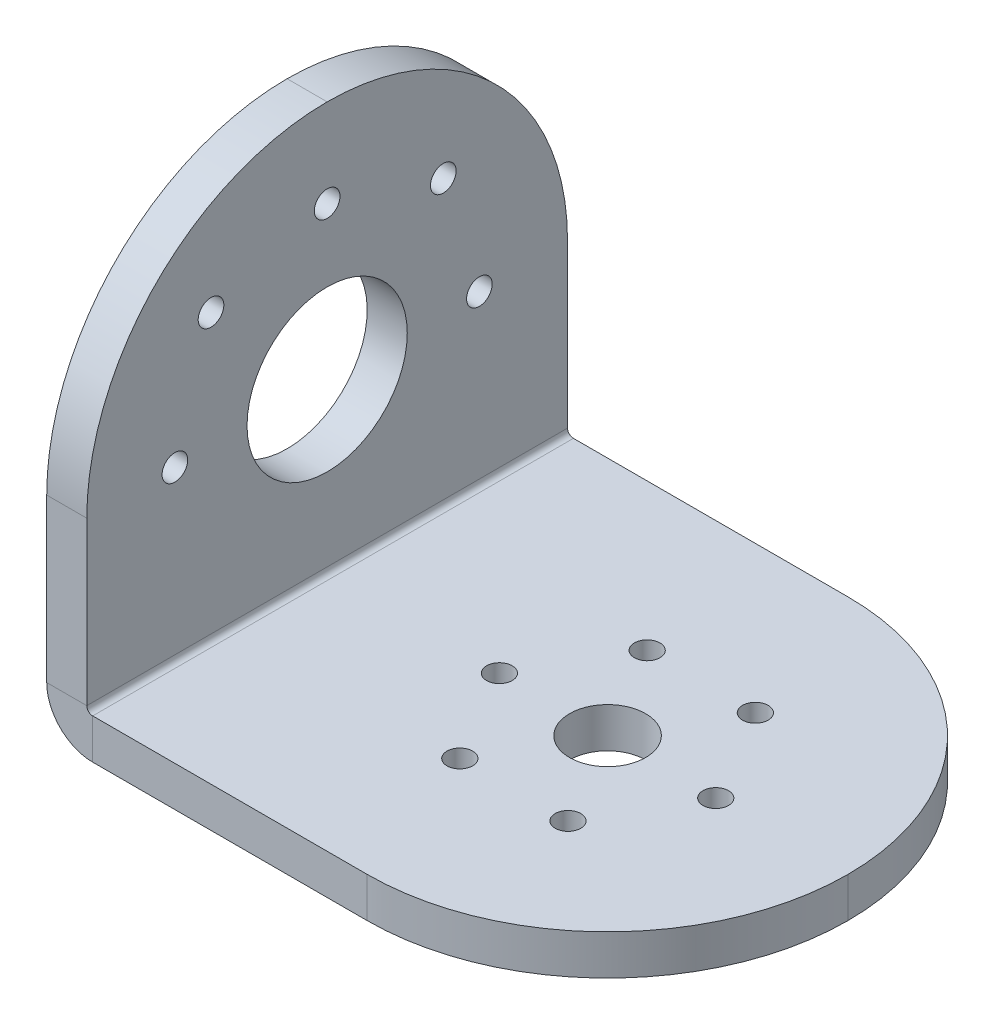
ISO-10303-21;
HEADER;
FILE_DESCRIPTION(('STEP AP214'),'2;1');
FILE_NAME('part.step','',(''),(''),'','','');
FILE_SCHEMA(('AUTOMOTIVE_DESIGN { 1 0 10303 214 1 1 1 1 }'));
ENDSEC;
DATA;
#1=APPLICATION_CONTEXT('core data for automotive mechanical design processes');
#2=APPLICATION_PROTOCOL_DEFINITION('international standard','automotive_design',2000,#1);
#3=PRODUCT_CONTEXT('',#1,'mechanical');
#4=PRODUCT('Part','Part','',(#3));
#5=PRODUCT_RELATED_PRODUCT_CATEGORY('part','',(#4));
#6=PRODUCT_DEFINITION_FORMATION('','',#4);
#7=PRODUCT_DEFINITION_CONTEXT('part definition',#1,'design');
#8=PRODUCT_DEFINITION('design','',#6,#7);
#9=PRODUCT_DEFINITION_SHAPE('','',#8);
#10=(LENGTH_UNIT() NAMED_UNIT(*) SI_UNIT(.MILLI.,.METRE.));
#11=(NAMED_UNIT(*) PLANE_ANGLE_UNIT() SI_UNIT($,.RADIAN.));
#12=(NAMED_UNIT(*) SI_UNIT($,.STERADIAN.) SOLID_ANGLE_UNIT());
#13=UNCERTAINTY_MEASURE_WITH_UNIT(LENGTH_MEASURE(1.E-05),#10,'distance_accuracy_value','');
#14=(GEOMETRIC_REPRESENTATION_CONTEXT(3) GLOBAL_UNCERTAINTY_ASSIGNED_CONTEXT((#13)) GLOBAL_UNIT_ASSIGNED_CONTEXT((#10,
#11,#12)) REPRESENTATION_CONTEXT('',''));
#15=CARTESIAN_POINT('',(0.,0.,0.));
#16=DIRECTION('',(0.,0.,1.));
#17=DIRECTION('',(1.,0.,0.));
#18=AXIS2_PLACEMENT_3D('',#15,#16,#17);
#19=CARTESIAN_POINT('',(0.,56.,30.));
#20=DIRECTION('',(1.,0.,0.));
#21=DIRECTION('',(0.,1.,0.));
#22=AXIS2_PLACEMENT_3D('',#19,#20,#21);
#23=PLANE('',#22);
#24=CARTESIAN_POINT('',(0.,45.,0.));
#25=DIRECTION('',(-1.,0.,0.));
#26=DIRECTION('',(0.,0.,1.));
#27=AXIS2_PLACEMENT_3D('',#24,#25,#26);
#28=CIRCLE('',#27,1.60000000000001);
#29=CARTESIAN_POINT('',(0.,45.,1.60000000000001));
#30=VERTEX_POINT('',#29);
#31=EDGE_CURVE('E266',#30,#30,#28,.T.);
#32=ORIENTED_EDGE('',*,*,#31,.F.);
#33=EDGE_LOOP('',(#32));
#34=FACE_BOUND('',#33,.T.);
#35=CARTESIAN_POINT('',(0.,26.,-19.));
#36=DIRECTION('',(-1.,0.,0.));
#37=DIRECTION('',(0.,0.,1.));
#38=AXIS2_PLACEMENT_3D('',#35,#36,#37);
#39=CIRCLE('',#38,1.60000000000001);
#40=CARTESIAN_POINT('',(0.,26.,-17.4));
#41=VERTEX_POINT('',#40);
#42=EDGE_CURVE('E260',#41,#41,#39,.T.);
#43=ORIENTED_EDGE('',*,*,#42,.F.);
#44=EDGE_LOOP('',(#43));
#45=FACE_BOUND('',#44,.T.);
#46=CARTESIAN_POINT('',(0.,26.,19.));
#47=DIRECTION('',(-1.,0.,0.));
#48=DIRECTION('',(0.,0.,1.));
#49=AXIS2_PLACEMENT_3D('',#46,#47,#48);
#50=CIRCLE('',#49,1.60000000000001);
#51=CARTESIAN_POINT('',(0.,26.,20.6));
#52=VERTEX_POINT('',#51);
#53=EDGE_CURVE('E129',#52,#52,#50,.T.);
#54=ORIENTED_EDGE('',*,*,#53,.F.);
#55=EDGE_LOOP('',(#54));
#56=FACE_BOUND('',#55,.T.);
#57=CARTESIAN_POINT('',(0.,40.4956890143242,14.4956890143242));
#58=DIRECTION('',(-1.,0.,0.));
#59=DIRECTION('',(0.,0.,1.));
#60=AXIS2_PLACEMENT_3D('',#57,#58,#59);
#61=CIRCLE('',#60,1.60000000000002);
#62=CARTESIAN_POINT('',(0.,40.4956890143242,16.0956890143242));
#63=VERTEX_POINT('',#62);
#64=EDGE_CURVE('E250',#63,#63,#61,.T.);
#65=ORIENTED_EDGE('',*,*,#64,.F.);
#66=EDGE_LOOP('',(#65));
#67=FACE_BOUND('',#66,.T.);
#68=CARTESIAN_POINT('',(0.,40.4956890143242,-14.4956890143242));
#69=DIRECTION('',(-1.,0.,0.));
#70=DIRECTION('',(0.,0.,1.));
#71=AXIS2_PLACEMENT_3D('',#68,#69,#70);
#72=CIRCLE('',#71,1.60000000000002);
#73=CARTESIAN_POINT('',(0.,40.4956890143242,-12.8956890143242));
#74=VERTEX_POINT('',#73);
#75=EDGE_CURVE('E244',#74,#74,#72,.T.);
#76=ORIENTED_EDGE('',*,*,#75,.F.);
#77=EDGE_LOOP('',(#76));
#78=FACE_BOUND('',#77,.T.);
#79=CARTESIAN_POINT('',(0.,26.,0.));
#80=DIRECTION('',(-1.,0.,0.));
#81=DIRECTION('',(0.,-1.,0.));
#82=AXIS2_PLACEMENT_3D('',#79,#80,#81);
#83=CIRCLE('',#82,10.);
#84=CARTESIAN_POINT('',(0.,16.,0.));
#85=VERTEX_POINT('',#84);
#86=EDGE_CURVE('E238',#85,#85,#83,.T.);
#87=ORIENTED_EDGE('',*,*,#86,.F.);
#88=EDGE_LOOP('',(#87));
#89=FACE_BOUND('',#88,.T.);
#90=DIRECTION('',(0.,-1.,0.));
#91=VECTOR('',#90,1.);
#92=CARTESIAN_POINT('',(0.,56.,-30.));
#93=LINE('',#92,#91);
#94=CARTESIAN_POINT('',(0.,26.,-30.));
#95=VERTEX_POINT('',#94);
#96=CARTESIAN_POINT('',(0.,5.7366,-30.));
#97=VERTEX_POINT('',#96);
#98=EDGE_CURVE('E167',#95,#97,#93,.T.);
#99=ORIENTED_EDGE('',*,*,#98,.T.);
#100=DIRECTION('',(0.,0.,-1.));
#101=VECTOR('',#100,1.);
#102=CARTESIAN_POINT('',(0.,5.7366,30.));
#103=LINE('',#102,#101);
#104=CARTESIAN_POINT('',(0.,5.7366,30.));
#105=VERTEX_POINT('',#104);
#106=EDGE_CURVE('E151',#105,#97,#103,.T.);
#107=ORIENTED_EDGE('',*,*,#106,.F.);
#108=DIRECTION('',(0.,-1.,0.));
#109=VECTOR('',#108,1.);
#110=CARTESIAN_POINT('',(0.,56.,30.));
#111=LINE('',#110,#109);
#112=CARTESIAN_POINT('',(0.,26.,30.));
#113=VERTEX_POINT('',#112);
#114=EDGE_CURVE('E183',#113,#105,#111,.T.);
#115=ORIENTED_EDGE('',*,*,#114,.F.);
#116=CARTESIAN_POINT('',(0.,26.,0.));
#117=DIRECTION('',(1.,0.,0.));
#118=DIRECTION('',(0.,1.,0.));
#119=AXIS2_PLACEMENT_3D('',#116,#117,#118);
#120=CIRCLE('',#119,30.);
#121=CARTESIAN_POINT('',(0.,56.,0.));
#122=VERTEX_POINT('',#121);
#123=EDGE_CURVE('E67',#113,#122,#120,.F.);
#124=ORIENTED_EDGE('',*,*,#123,.T.);
#125=CARTESIAN_POINT('',(0.,26.,0.));
#126=DIRECTION('',(1.,0.,0.));
#127=DIRECTION('',(0.,1.,0.));
#128=AXIS2_PLACEMENT_3D('',#125,#126,#127);
#129=CIRCLE('',#128,30.);
#130=EDGE_CURVE('E51',#122,#95,#129,.F.);
#131=ORIENTED_EDGE('',*,*,#130,.T.);
#132=EDGE_LOOP('',(#99,#107,#115,#124,#131));
#133=FACE_BOUND('',#132,.T.);
#134=ADVANCED_FACE('F42',(#34,#45,#56,#67,#78,#89,#133),#23,.F.);
#135=CARTESIAN_POINT('',(0.,5.7366,30.));
#136=DIRECTION('',(0.,0.,1.));
#137=DIRECTION('',(1.,0.,0.));
#138=AXIS2_PLACEMENT_3D('',#135,#136,#137);
#139=PLANE('',#138);
#140=DIRECTION('',(1.,0.,0.));
#141=VECTOR('',#140,1.);
#142=CARTESIAN_POINT('',(0.,5.7366,30.));
#143=LINE('',#142,#141);
#144=CARTESIAN_POINT('',(5.,5.7366,30.));
#145=VERTEX_POINT('',#144);
#146=EDGE_CURVE('E314',#105,#145,#143,.T.);
#147=ORIENTED_EDGE('',*,*,#146,.F.);
#148=CARTESIAN_POINT('',(5.7366,5.7366,30.));
#149=DIRECTION('',(0.,0.,1.));
#150=DIRECTION('',(1.,0.,0.));
#151=AXIS2_PLACEMENT_3D('',#148,#149,#150);
#152=CIRCLE('',#151,5.7366);
#153=CARTESIAN_POINT('',(5.73659999999999,0.,30.));
#154=VERTEX_POINT('',#153);
#155=EDGE_CURVE('E161',#105,#154,#152,.T.);
#156=ORIENTED_EDGE('',*,*,#155,.T.);
#157=DIRECTION('',(0.,-1.,0.));
#158=VECTOR('',#157,1.);
#159=CARTESIAN_POINT('',(5.73659999999999,5.,30.));
#160=LINE('',#159,#158);
#161=CARTESIAN_POINT('',(5.73659999999999,5.,30.));
#162=VERTEX_POINT('',#161);
#163=EDGE_CURVE('E318',#162,#154,#160,.T.);
#164=ORIENTED_EDGE('',*,*,#163,.F.);
#165=CARTESIAN_POINT('',(5.7366,5.7366,30.));
#166=DIRECTION('',(0.,0.,1.));
#167=DIRECTION('',(1.,0.,0.));
#168=AXIS2_PLACEMENT_3D('',#165,#166,#167);
#169=CIRCLE('',#168,0.7366);
#170=EDGE_CURVE('E186',#145,#162,#169,.T.);
#171=ORIENTED_EDGE('',*,*,#170,.F.);
#172=EDGE_LOOP('',(#147,#156,#164,#171));
#173=FACE_BOUND('',#172,.T.);
#174=ADVANCED_FACE('F275',(#173),#139,.T.);
#175=CARTESIAN_POINT('',(5.73659999999999,5.,30.));
#176=DIRECTION('',(0.,0.,1.));
#177=DIRECTION('',(1.,0.,0.));
#178=AXIS2_PLACEMENT_3D('',#175,#176,#177);
#179=PLANE('',#178);
#180=DIRECTION('',(0.,-1.,0.));
#181=VECTOR('',#180,1.);
#182=CARTESIAN_POINT('',(5.,56.,30.));
#183=LINE('',#182,#181);
#184=CARTESIAN_POINT('',(5.,26.,30.));
#185=VERTEX_POINT('',#184);
#186=EDGE_CURVE('E144',#185,#145,#183,.T.);
#187=ORIENTED_EDGE('',*,*,#186,.F.);
#188=DIRECTION('',(1.,0.,0.));
#189=VECTOR('',#188,1.);
#190=CARTESIAN_POINT('',(5.73659999999999,26.,30.));
#191=LINE('',#190,#189);
#192=EDGE_CURVE('E11',#185,#113,#191,.F.);
#193=ORIENTED_EDGE('',*,*,#192,.T.);
#194=ORIENTED_EDGE('',*,*,#114,.T.);
#195=ORIENTED_EDGE('',*,*,#146,.T.);
#196=EDGE_LOOP('',(#187,#193,#194,#195));
#197=FACE_BOUND('',#196,.T.);
#198=ADVANCED_FACE('F345',(#197),#179,.T.);
#199=CARTESIAN_POINT('',(5.73659999999999,0.,-30.));
#200=DIRECTION('',(0.,0.,-1.));
#201=DIRECTION('',(-1.,0.,0.));
#202=AXIS2_PLACEMENT_3D('',#199,#200,#201);
#203=PLANE('',#202);
#204=DIRECTION('',(0.,1.,0.));
#205=VECTOR('',#204,1.);
#206=CARTESIAN_POINT('',(5.73659999999999,0.,-30.));
#207=LINE('',#206,#205);
#208=CARTESIAN_POINT('',(5.73659999999999,0.,-30.));
#209=VERTEX_POINT('',#208);
#210=CARTESIAN_POINT('',(5.73659999999999,5.,-30.));
#211=VERTEX_POINT('',#210);
#212=EDGE_CURVE('E296',#209,#211,#207,.T.);
#213=ORIENTED_EDGE('',*,*,#212,.F.);
#214=CARTESIAN_POINT('',(5.7366,5.7366,-30.));
#215=DIRECTION('',(0.,0.,1.));
#216=DIRECTION('',(1.,0.,0.));
#217=AXIS2_PLACEMENT_3D('',#214,#215,#216);
#218=CIRCLE('',#217,5.7366);
#219=EDGE_CURVE('E164',#97,#209,#218,.T.);
#220=ORIENTED_EDGE('',*,*,#219,.F.);
#221=DIRECTION('',(-1.,0.,0.));
#222=VECTOR('',#221,1.);
#223=CARTESIAN_POINT('',(5.,5.7366,-30.));
#224=LINE('',#223,#222);
#225=CARTESIAN_POINT('',(5.,5.7366,-30.));
#226=VERTEX_POINT('',#225);
#227=EDGE_CURVE('E148',#226,#97,#224,.T.);
#228=ORIENTED_EDGE('',*,*,#227,.F.);
#229=CARTESIAN_POINT('',(5.7366,5.7366,-30.));
#230=DIRECTION('',(0.,0.,1.));
#231=DIRECTION('',(1.,0.,0.));
#232=AXIS2_PLACEMENT_3D('',#229,#230,#231);
#233=CIRCLE('',#232,0.7366);
#234=EDGE_CURVE('E171',#226,#211,#233,.T.);
#235=ORIENTED_EDGE('',*,*,#234,.T.);
#236=EDGE_LOOP('',(#213,#220,#228,#235));
#237=FACE_BOUND('',#236,.T.);
#238=ADVANCED_FACE('F298',(#237),#203,.T.);
#239=CARTESIAN_POINT('',(5.,5.7366,-30.));
#240=DIRECTION('',(0.,0.,-1.));
#241=DIRECTION('',(-1.,0.,0.));
#242=AXIS2_PLACEMENT_3D('',#239,#240,#241);
#243=PLANE('',#242);
#244=DIRECTION('',(1.,0.,0.));
#245=VECTOR('',#244,1.);
#246=CARTESIAN_POINT('',(70.,5.,-30.));
#247=LINE('',#246,#245);
#248=CARTESIAN_POINT('',(40.,5.,-30.));
#249=VERTEX_POINT('',#248);
#250=EDGE_CURVE('E174',#211,#249,#247,.T.);
#251=ORIENTED_EDGE('',*,*,#250,.T.);
#252=DIRECTION('',(0.,-1.,0.));
#253=VECTOR('',#252,1.);
#254=CARTESIAN_POINT('',(40.,5.7366,-30.));
#255=LINE('',#254,#253);
#256=CARTESIAN_POINT('',(40.,0.,-30.));
#257=VERTEX_POINT('',#256);
#258=EDGE_CURVE('E309',#249,#257,#255,.T.);
#259=ORIENTED_EDGE('',*,*,#258,.T.);
#260=DIRECTION('',(1.,0.,0.));
#261=VECTOR('',#260,1.);
#262=CARTESIAN_POINT('',(70.,0.,-30.));
#263=LINE('',#262,#261);
#264=EDGE_CURVE('E177',#209,#257,#263,.T.);
#265=ORIENTED_EDGE('',*,*,#264,.F.);
#266=ORIENTED_EDGE('',*,*,#212,.T.);
#267=EDGE_LOOP('',(#251,#259,#265,#266));
#268=FACE_BOUND('',#267,.T.);
#269=ADVANCED_FACE('F307',(#268),#243,.T.);
#270=CARTESIAN_POINT('',(70.,0.,30.));
#271=DIRECTION('',(0.,1.,0.));
#272=DIRECTION('',(-1.,0.,0.));
#273=AXIS2_PLACEMENT_3D('',#270,#271,#272);
#274=PLANE('',#273);
#275=CARTESIAN_POINT('',(46.75,0.,11.6913429510899));
#276=DIRECTION('',(0.,1.,0.));
#277=DIRECTION('',(-1.,0.,0.));
#278=AXIS2_PLACEMENT_3D('',#275,#276,#277);
#279=CIRCLE('',#278,1.60000000000001);
#280=CARTESIAN_POINT('',(45.15,0.,11.6913429510899));
#281=VERTEX_POINT('',#280);
#282=EDGE_CURVE('E229',#281,#281,#279,.T.);
#283=ORIENTED_EDGE('',*,*,#282,.T.);
#284=EDGE_LOOP('',(#283));
#285=FACE_BOUND('',#284,.T.);
#286=CARTESIAN_POINT('',(53.5,0.,0.));
#287=DIRECTION('',(0.,1.,0.));
#288=DIRECTION('',(-1.,0.,0.));
#289=AXIS2_PLACEMENT_3D('',#286,#287,#288);
#290=CIRCLE('',#289,1.60000000000001);
#291=CARTESIAN_POINT('',(51.9,0.,0.));
#292=VERTEX_POINT('',#291);
#293=EDGE_CURVE('E223',#292,#292,#290,.T.);
#294=ORIENTED_EDGE('',*,*,#293,.T.);
#295=EDGE_LOOP('',(#294));
#296=FACE_BOUND('',#295,.T.);
#297=CARTESIAN_POINT('',(46.75,0.,-11.6913429510899));
#298=DIRECTION('',(0.,1.,0.));
#299=DIRECTION('',(-1.,0.,0.));
#300=AXIS2_PLACEMENT_3D('',#297,#298,#299);
#301=CIRCLE('',#300,1.60000000000001);
#302=CARTESIAN_POINT('',(45.15,0.,-11.6913429510899));
#303=VERTEX_POINT('',#302);
#304=EDGE_CURVE('E217',#303,#303,#301,.T.);
#305=ORIENTED_EDGE('',*,*,#304,.T.);
#306=EDGE_LOOP('',(#305));
#307=FACE_BOUND('',#306,.T.);
#308=CARTESIAN_POINT('',(33.25,0.,-11.6913429510899));
#309=DIRECTION('',(0.,1.,0.));
#310=DIRECTION('',(-1.,0.,0.));
#311=AXIS2_PLACEMENT_3D('',#308,#309,#310);
#312=CIRCLE('',#311,1.60000000000001);
#313=CARTESIAN_POINT('',(31.65,0.,-11.6913429510899));
#314=VERTEX_POINT('',#313);
#315=EDGE_CURVE('E211',#314,#314,#312,.T.);
#316=ORIENTED_EDGE('',*,*,#315,.T.);
#317=EDGE_LOOP('',(#316));
#318=FACE_BOUND('',#317,.T.);
#319=CARTESIAN_POINT('',(26.5,0.,0.));
#320=DIRECTION('',(0.,1.,0.));
#321=DIRECTION('',(-1.,0.,0.));
#322=AXIS2_PLACEMENT_3D('',#319,#320,#321);
#323=CIRCLE('',#322,1.60000000000001);
#324=CARTESIAN_POINT('',(24.9,0.,0.));
#325=VERTEX_POINT('',#324);
#326=EDGE_CURVE('E205',#325,#325,#323,.T.);
#327=ORIENTED_EDGE('',*,*,#326,.T.);
#328=EDGE_LOOP('',(#327));
#329=FACE_BOUND('',#328,.T.);
#330=CARTESIAN_POINT('',(33.25,0.,11.6913429510899));
#331=DIRECTION('',(0.,1.,0.));
#332=DIRECTION('',(-1.,0.,0.));
#333=AXIS2_PLACEMENT_3D('',#330,#331,#332);
#334=CIRCLE('',#333,1.60000000000001);
#335=CARTESIAN_POINT('',(31.65,0.,11.6913429510899));
#336=VERTEX_POINT('',#335);
#337=EDGE_CURVE('E199',#336,#336,#334,.T.);
#338=ORIENTED_EDGE('',*,*,#337,.T.);
#339=EDGE_LOOP('',(#338));
#340=FACE_BOUND('',#339,.T.);
#341=CARTESIAN_POINT('',(40.,0.,0.));
#342=DIRECTION('',(0.,1.,0.));
#343=DIRECTION('',(-1.,0.,0.));
#344=AXIS2_PLACEMENT_3D('',#341,#342,#343);
#345=CIRCLE('',#344,4.75);
#346=CARTESIAN_POINT('',(35.25,0.,0.));
#347=VERTEX_POINT('',#346);
#348=EDGE_CURVE('E193',#347,#347,#345,.T.);
#349=ORIENTED_EDGE('',*,*,#348,.T.);
#350=EDGE_LOOP('',(#349));
#351=FACE_BOUND('',#350,.T.);
#352=ORIENTED_EDGE('',*,*,#264,.T.);
#353=CARTESIAN_POINT('',(40.,0.,0.));
#354=DIRECTION('',(0.,1.,0.));
#355=DIRECTION('',(-1.,0.,0.));
#356=AXIS2_PLACEMENT_3D('',#353,#354,#355);
#357=CIRCLE('',#356,30.);
#358=CARTESIAN_POINT('',(70.,0.,0.));
#359=VERTEX_POINT('',#358);
#360=EDGE_CURVE('E316',#257,#359,#357,.F.);
#361=ORIENTED_EDGE('',*,*,#360,.T.);
#362=CARTESIAN_POINT('',(40.,0.,0.));
#363=DIRECTION('',(0.,1.,0.));
#364=DIRECTION('',(-1.,0.,0.));
#365=AXIS2_PLACEMENT_3D('',#362,#363,#364);
#366=CIRCLE('',#365,30.);
#367=CARTESIAN_POINT('',(40.,0.,30.));
#368=VERTEX_POINT('',#367);
#369=EDGE_CURVE('E313',#359,#368,#366,.F.);
#370=ORIENTED_EDGE('',*,*,#369,.T.);
#371=DIRECTION('',(1.,0.,0.));
#372=VECTOR('',#371,1.);
#373=CARTESIAN_POINT('',(70.,0.,30.));
#374=LINE('',#373,#372);
#375=EDGE_CURVE('E166',#154,#368,#374,.T.);
#376=ORIENTED_EDGE('',*,*,#375,.F.);
#377=DIRECTION('',(0.,0.,-1.));
#378=VECTOR('',#377,1.);
#379=CARTESIAN_POINT('',(5.73659999999999,0.,30.));
#380=LINE('',#379,#378);
#381=EDGE_CURVE('E154',#154,#209,#380,.T.);
#382=ORIENTED_EDGE('',*,*,#381,.T.);
#383=EDGE_LOOP('',(#352,#361,#370,#376,#382));
#384=FACE_BOUND('',#383,.T.);
#385=ADVANCED_FACE('F304',(#285,#296,#307,#318,#329,#340,#351,#384),#274,.F.);
#386=CARTESIAN_POINT('',(70.,5.,30.));
#387=DIRECTION('',(0.,1.,0.));
#388=DIRECTION('',(-1.,0.,0.));
#389=AXIS2_PLACEMENT_3D('',#386,#387,#388);
#390=PLANE('',#389);
#391=CARTESIAN_POINT('',(46.75,5.,11.6913429510899));
#392=DIRECTION('',(0.,1.,0.));
#393=DIRECTION('',(0.,0.,1.));
#394=AXIS2_PLACEMENT_3D('',#391,#392,#393);
#395=CIRCLE('',#394,1.60000000000002);
#396=CARTESIAN_POINT('',(46.75,5.,13.2913429510899));
#397=VERTEX_POINT('',#396);
#398=EDGE_CURVE('E232',#397,#397,#395,.T.);
#399=ORIENTED_EDGE('',*,*,#398,.F.);
#400=EDGE_LOOP('',(#399));
#401=FACE_BOUND('',#400,.T.);
#402=CARTESIAN_POINT('',(53.5,5.,0.));
#403=DIRECTION('',(0.,1.,0.));
#404=DIRECTION('',(0.,0.,1.));
#405=AXIS2_PLACEMENT_3D('',#402,#403,#404);
#406=CIRCLE('',#405,1.60000000000001);
#407=CARTESIAN_POINT('',(53.5,5.,1.60000000000002));
#408=VERTEX_POINT('',#407);
#409=EDGE_CURVE('E226',#408,#408,#406,.T.);
#410=ORIENTED_EDGE('',*,*,#409,.F.);
#411=EDGE_LOOP('',(#410));
#412=FACE_BOUND('',#411,.T.);
#413=CARTESIAN_POINT('',(46.75,5.,-11.6913429510899));
#414=DIRECTION('',(0.,1.,0.));
#415=DIRECTION('',(0.,0.,1.));
#416=AXIS2_PLACEMENT_3D('',#413,#414,#415);
#417=CIRCLE('',#416,1.60000000000002);
#418=CARTESIAN_POINT('',(46.75,5.,-10.0913429510899));
#419=VERTEX_POINT('',#418);
#420=EDGE_CURVE('E220',#419,#419,#417,.T.);
#421=ORIENTED_EDGE('',*,*,#420,.F.);
#422=EDGE_LOOP('',(#421));
#423=FACE_BOUND('',#422,.T.);
#424=CARTESIAN_POINT('',(33.25,5.,-11.6913429510899));
#425=DIRECTION('',(0.,1.,0.));
#426=DIRECTION('',(0.,0.,1.));
#427=AXIS2_PLACEMENT_3D('',#424,#425,#426);
#428=CIRCLE('',#427,1.60000000000001);
#429=CARTESIAN_POINT('',(33.25,5.,-10.0913429510899));
#430=VERTEX_POINT('',#429);
#431=EDGE_CURVE('E214',#430,#430,#428,.T.);
#432=ORIENTED_EDGE('',*,*,#431,.F.);
#433=EDGE_LOOP('',(#432));
#434=FACE_BOUND('',#433,.T.);
#435=CARTESIAN_POINT('',(26.5,5.,0.));
#436=DIRECTION('',(0.,1.,0.));
#437=DIRECTION('',(0.,0.,1.));
#438=AXIS2_PLACEMENT_3D('',#435,#436,#437);
#439=CIRCLE('',#438,1.60000000000001);
#440=CARTESIAN_POINT('',(26.5,5.,1.60000000000001));
#441=VERTEX_POINT('',#440);
#442=EDGE_CURVE('E208',#441,#441,#439,.T.);
#443=ORIENTED_EDGE('',*,*,#442,.F.);
#444=EDGE_LOOP('',(#443));
#445=FACE_BOUND('',#444,.T.);
#446=CARTESIAN_POINT('',(33.25,5.,11.6913429510899));
#447=DIRECTION('',(0.,1.,0.));
#448=DIRECTION('',(0.,0.,1.));
#449=AXIS2_PLACEMENT_3D('',#446,#447,#448);
#450=CIRCLE('',#449,1.60000000000002);
#451=CARTESIAN_POINT('',(33.25,5.,13.2913429510899));
#452=VERTEX_POINT('',#451);
#453=EDGE_CURVE('E202',#452,#452,#450,.T.);
#454=ORIENTED_EDGE('',*,*,#453,.F.);
#455=EDGE_LOOP('',(#454));
#456=FACE_BOUND('',#455,.T.);
#457=CARTESIAN_POINT('',(40.,5.,0.));
#458=DIRECTION('',(0.,1.,0.));
#459=DIRECTION('',(-1.,0.,0.));
#460=AXIS2_PLACEMENT_3D('',#457,#458,#459);
#461=CIRCLE('',#460,4.75);
#462=CARTESIAN_POINT('',(35.25,5.,0.));
#463=VERTEX_POINT('',#462);
#464=EDGE_CURVE('E196',#463,#463,#461,.T.);
#465=ORIENTED_EDGE('',*,*,#464,.F.);
#466=EDGE_LOOP('',(#465));
#467=FACE_BOUND('',#466,.T.);
#468=CARTESIAN_POINT('',(40.,5.,0.));
#469=DIRECTION('',(0.,1.,0.));
#470=DIRECTION('',(-1.,0.,0.));
#471=AXIS2_PLACEMENT_3D('',#468,#469,#470);
#472=CIRCLE('',#471,30.);
#473=CARTESIAN_POINT('',(40.,5.,30.));
#474=VERTEX_POINT('',#473);
#475=CARTESIAN_POINT('',(70.,5.,0.));
#476=VERTEX_POINT('',#475);
#477=EDGE_CURVE('E323',#474,#476,#472,.T.);
#478=ORIENTED_EDGE('',*,*,#477,.T.);
#479=CARTESIAN_POINT('',(40.,5.,0.));
#480=DIRECTION('',(0.,1.,0.));
#481=DIRECTION('',(-1.,0.,0.));
#482=AXIS2_PLACEMENT_3D('',#479,#480,#481);
#483=CIRCLE('',#482,30.);
#484=EDGE_CURVE('E325',#476,#249,#483,.T.);
#485=ORIENTED_EDGE('',*,*,#484,.T.);
#486=ORIENTED_EDGE('',*,*,#250,.F.);
#487=DIRECTION('',(0.,0.,-1.));
#488=VECTOR('',#487,1.);
#489=CARTESIAN_POINT('',(5.73659999999999,5.,30.));
#490=LINE('',#489,#488);
#491=EDGE_CURVE('E146',#162,#211,#490,.T.);
#492=ORIENTED_EDGE('',*,*,#491,.F.);
#493=DIRECTION('',(1.,0.,0.));
#494=VECTOR('',#493,1.);
#495=CARTESIAN_POINT('',(70.,5.,30.));
#496=LINE('',#495,#494);
#497=EDGE_CURVE('E188',#162,#474,#496,.T.);
#498=ORIENTED_EDGE('',*,*,#497,.T.);
#499=EDGE_LOOP('',(#478,#485,#486,#492,#498));
#500=FACE_BOUND('',#499,.T.);
#501=ADVANCED_FACE('F351',(#401,#412,#423,#434,#445,#456,#467,#500),#390,.T.);
#502=CARTESIAN_POINT('',(5.7366,5.7366,30.));
#503=DIRECTION('',(0.,0.,-1.));
#504=DIRECTION('',(-1.,0.,0.));
#505=AXIS2_PLACEMENT_3D('',#502,#503,#504);
#506=CYLINDRICAL_SURFACE('',#505,0.7366);
#507=ORIENTED_EDGE('',*,*,#234,.F.);
#508=DIRECTION('',(0.,0.,-1.));
#509=VECTOR('',#508,1.);
#510=CARTESIAN_POINT('',(5.,5.7366,30.));
#511=LINE('',#510,#509);
#512=CARTESIAN_POINT('',(5.,5.7366,-0.981743571407549));
#513=VERTEX_POINT('',#512);
#514=EDGE_CURVE('E139',#513,#226,#511,.T.);
#515=ORIENTED_EDGE('',*,*,#514,.F.);
#516=CARTESIAN_POINT('',(5.,5.7366,0.981743571407556));
#517=VERTEX_POINT('',#516);
#518=EDGE_CURVE('E127',#517,#513,#511,.T.);
#519=ORIENTED_EDGE('',*,*,#518,.F.);
#520=EDGE_CURVE('E137',#145,#517,#511,.T.);
#521=ORIENTED_EDGE('',*,*,#520,.F.);
#522=ORIENTED_EDGE('',*,*,#170,.T.);
#523=ORIENTED_EDGE('',*,*,#491,.T.);
#524=EDGE_LOOP('',(#507,#515,#519,#521,#522,#523));
#525=FACE_BOUND('',#524,.T.);
#526=ADVANCED_FACE('F135',(#525),#506,.F.);
#527=CARTESIAN_POINT('',(5.,56.,30.));
#528=DIRECTION('',(1.,0.,0.));
#529=DIRECTION('',(0.,1.,0.));
#530=AXIS2_PLACEMENT_3D('',#527,#528,#529);
#531=PLANE('',#530);
#532=CARTESIAN_POINT('',(5.,45.,0.));
#533=DIRECTION('',(1.,0.,0.));
#534=DIRECTION('',(0.,1.,0.));
#535=AXIS2_PLACEMENT_3D('',#532,#533,#534);
#536=CIRCLE('',#535,1.60000000000001);
#537=CARTESIAN_POINT('',(5.,46.6,0.));
#538=VERTEX_POINT('',#537);
#539=EDGE_CURVE('E263',#538,#538,#536,.T.);
#540=ORIENTED_EDGE('',*,*,#539,.F.);
#541=EDGE_LOOP('',(#540));
#542=FACE_BOUND('',#541,.T.);
#543=CARTESIAN_POINT('',(5.,26.,-19.));
#544=DIRECTION('',(1.,0.,0.));
#545=DIRECTION('',(0.,1.,0.));
#546=AXIS2_PLACEMENT_3D('',#543,#544,#545);
#547=CIRCLE('',#546,1.60000000000001);
#548=CARTESIAN_POINT('',(5.,27.6,-19.));
#549=VERTEX_POINT('',#548);
#550=EDGE_CURVE('E130',#549,#549,#547,.T.);
#551=ORIENTED_EDGE('',*,*,#550,.F.);
#552=EDGE_LOOP('',(#551));
#553=FACE_BOUND('',#552,.T.);
#554=ORIENTED_EDGE('',*,*,#520,.T.);
#555=CARTESIAN_POINT('',(5.,7.,0.));
#556=DIRECTION('',(1.,0.,0.));
#557=DIRECTION('',(0.,1.,0.));
#558=AXIS2_PLACEMENT_3D('',#555,#556,#557);
#559=CIRCLE('',#558,1.60000000000001);
#560=EDGE_CURVE('E59',#513,#517,#559,.F.);
#561=ORIENTED_EDGE('',*,*,#560,.F.);
#562=ORIENTED_EDGE('',*,*,#514,.T.);
#563=DIRECTION('',(0.,-1.,0.));
#564=VECTOR('',#563,1.);
#565=CARTESIAN_POINT('',(5.,56.,-30.));
#566=LINE('',#565,#564);
#567=CARTESIAN_POINT('',(5.,26.,-30.));
#568=VERTEX_POINT('',#567);
#569=EDGE_CURVE('E169',#568,#226,#566,.T.);
#570=ORIENTED_EDGE('',*,*,#569,.F.);
#571=CARTESIAN_POINT('',(5.,26.,0.));
#572=DIRECTION('',(1.,0.,0.));
#573=DIRECTION('',(0.,1.,0.));
#574=AXIS2_PLACEMENT_3D('',#571,#572,#573);
#575=CIRCLE('',#574,30.);
#576=CARTESIAN_POINT('',(5.,56.,0.));
#577=VERTEX_POINT('',#576);
#578=EDGE_CURVE('E333',#568,#577,#575,.T.);
#579=ORIENTED_EDGE('',*,*,#578,.T.);
#580=CARTESIAN_POINT('',(5.,26.,0.));
#581=DIRECTION('',(1.,0.,0.));
#582=DIRECTION('',(0.,1.,0.));
#583=AXIS2_PLACEMENT_3D('',#580,#581,#582);
#584=CIRCLE('',#583,30.);
#585=EDGE_CURVE('E331',#577,#185,#584,.T.);
#586=ORIENTED_EDGE('',*,*,#585,.T.);
#587=ORIENTED_EDGE('',*,*,#186,.T.);
#588=EDGE_LOOP('',(#554,#561,#562,#570,#579,#586,#587));
#589=FACE_BOUND('',#588,.T.);
#590=CARTESIAN_POINT('',(5.,26.,19.));
#591=DIRECTION('',(1.,0.,0.));
#592=DIRECTION('',(0.,1.,0.));
#593=AXIS2_PLACEMENT_3D('',#590,#591,#592);
#594=CIRCLE('',#593,1.60000000000001);
#595=CARTESIAN_POINT('',(5.,27.6,19.));
#596=VERTEX_POINT('',#595);
#597=EDGE_CURVE('E253',#596,#596,#594,.T.);
#598=ORIENTED_EDGE('',*,*,#597,.F.);
#599=EDGE_LOOP('',(#598));
#600=FACE_BOUND('',#599,.T.);
#601=CARTESIAN_POINT('',(5.,40.4956890143242,14.4956890143242));
#602=DIRECTION('',(1.,0.,0.));
#603=DIRECTION('',(0.,1.,0.));
#604=AXIS2_PLACEMENT_3D('',#601,#602,#603);
#605=CIRCLE('',#604,1.60000000000001);
#606=CARTESIAN_POINT('',(5.,42.0956890143242,14.4956890143242));
#607=VERTEX_POINT('',#606);
#608=EDGE_CURVE('E247',#607,#607,#605,.T.);
#609=ORIENTED_EDGE('',*,*,#608,.F.);
#610=EDGE_LOOP('',(#609));
#611=FACE_BOUND('',#610,.T.);
#612=CARTESIAN_POINT('',(5.,40.4956890143242,-14.4956890143242));
#613=DIRECTION('',(1.,0.,0.));
#614=DIRECTION('',(0.,1.,0.));
#615=AXIS2_PLACEMENT_3D('',#612,#613,#614);
#616=CIRCLE('',#615,1.60000000000001);
#617=CARTESIAN_POINT('',(5.,42.0956890143242,-14.4956890143242));
#618=VERTEX_POINT('',#617);
#619=EDGE_CURVE('E241',#618,#618,#616,.T.);
#620=ORIENTED_EDGE('',*,*,#619,.F.);
#621=EDGE_LOOP('',(#620));
#622=FACE_BOUND('',#621,.T.);
#623=CARTESIAN_POINT('',(5.,26.,0.));
#624=DIRECTION('',(1.,0.,0.));
#625=DIRECTION('',(0.,1.,0.));
#626=AXIS2_PLACEMENT_3D('',#623,#624,#625);
#627=CIRCLE('',#626,10.);
#628=CARTESIAN_POINT('',(5.,36.,0.));
#629=VERTEX_POINT('',#628);
#630=EDGE_CURVE('E235',#629,#629,#627,.T.);
#631=ORIENTED_EDGE('',*,*,#630,.F.);
#632=EDGE_LOOP('',(#631));
#633=FACE_BOUND('',#632,.T.);
#634=ADVANCED_FACE('F141',(#542,#553,#589,#600,#611,#622,#633),#531,.T.);
#635=CARTESIAN_POINT('',(5.7366,5.7366,30.));
#636=DIRECTION('',(0.,0.,-1.));
#637=DIRECTION('',(-1.,0.,0.));
#638=AXIS2_PLACEMENT_3D('',#635,#636,#637);
#639=CYLINDRICAL_SURFACE('',#638,5.7366);
#640=ORIENTED_EDGE('',*,*,#106,.T.);
#641=ORIENTED_EDGE('',*,*,#219,.T.);
#642=ORIENTED_EDGE('',*,*,#381,.F.);
#643=ORIENTED_EDGE('',*,*,#155,.F.);
#644=EDGE_LOOP('',(#640,#641,#642,#643));
#645=FACE_BOUND('',#644,.T.);
#646=ADVANCED_FACE('F300',(#645),#639,.T.);
#647=CARTESIAN_POINT('',(5.7366,5.7366,30.));
#648=DIRECTION('',(0.,0.,1.));
#649=DIRECTION('',(1.,0.,0.));
#650=AXIS2_PLACEMENT_3D('',#647,#648,#649);
#651=PLANE('',#650);
#652=ORIENTED_EDGE('',*,*,#375,.T.);
#653=DIRECTION('',(0.,-1.,0.));
#654=VECTOR('',#653,1.);
#655=CARTESIAN_POINT('',(40.,5.7366,30.));
#656=LINE('',#655,#654);
#657=EDGE_CURVE('E327',#368,#474,#656,.F.);
#658=ORIENTED_EDGE('',*,*,#657,.T.);
#659=ORIENTED_EDGE('',*,*,#497,.F.);
#660=ORIENTED_EDGE('',*,*,#163,.T.);
#661=EDGE_LOOP('',(#652,#658,#659,#660));
#662=FACE_BOUND('',#661,.T.);
#663=ADVANCED_FACE('F383',(#662),#651,.T.);
#664=CARTESIAN_POINT('',(5.7366,5.7366,-30.));
#665=DIRECTION('',(0.,0.,1.));
#666=DIRECTION('',(1.,0.,0.));
#667=AXIS2_PLACEMENT_3D('',#664,#665,#666);
#668=PLANE('',#667);
#669=ORIENTED_EDGE('',*,*,#98,.F.);
#670=DIRECTION('',(1.,0.,0.));
#671=VECTOR('',#670,1.);
#672=CARTESIAN_POINT('',(5.,26.,-30.));
#673=LINE('',#672,#671);
#674=EDGE_CURVE('E329',#95,#568,#673,.T.);
#675=ORIENTED_EDGE('',*,*,#674,.T.);
#676=ORIENTED_EDGE('',*,*,#569,.T.);
#677=ORIENTED_EDGE('',*,*,#227,.T.);
#678=EDGE_LOOP('',(#669,#675,#676,#677));
#679=FACE_BOUND('',#678,.T.);
#680=ADVANCED_FACE('F294',(#679),#668,.F.);
#681=CARTESIAN_POINT('',(40.,5.,0.));
#682=DIRECTION('',(0.,-1.,0.));
#683=DIRECTION('',(0.,0.,-1.));
#684=AXIS2_PLACEMENT_3D('',#681,#682,#683);
#685=CYLINDRICAL_SURFACE('',#684,30.);
#686=DIRECTION('',(0.,-1.,0.));
#687=VECTOR('',#686,1.);
#688=CARTESIAN_POINT('',(70.,5.,0.));
#689=LINE('',#688,#687);
#690=EDGE_CURVE('E180',#476,#359,#689,.T.);
#691=ORIENTED_EDGE('',*,*,#690,.F.);
#692=ORIENTED_EDGE('',*,*,#477,.F.);
#693=ORIENTED_EDGE('',*,*,#657,.F.);
#694=ORIENTED_EDGE('',*,*,#369,.F.);
#695=EDGE_LOOP('',(#691,#692,#693,#694));
#696=FACE_BOUND('',#695,.T.);
#697=ADVANCED_FACE('F355',(#696),#685,.T.);
#698=CARTESIAN_POINT('',(40.,5.7366,0.));
#699=DIRECTION('',(0.,-1.,0.));
#700=DIRECTION('',(0.,0.,-1.));
#701=AXIS2_PLACEMENT_3D('',#698,#699,#700);
#702=CYLINDRICAL_SURFACE('',#701,30.);
#703=ORIENTED_EDGE('',*,*,#484,.F.);
#704=ORIENTED_EDGE('',*,*,#690,.T.);
#705=ORIENTED_EDGE('',*,*,#360,.F.);
#706=ORIENTED_EDGE('',*,*,#258,.F.);
#707=EDGE_LOOP('',(#703,#704,#705,#706));
#708=FACE_BOUND('',#707,.T.);
#709=ADVANCED_FACE('F353',(#708),#702,.T.);
#710=CARTESIAN_POINT('',(0.,26.,0.));
#711=DIRECTION('',(1.,0.,0.));
#712=DIRECTION('',(0.,0.,-1.));
#713=AXIS2_PLACEMENT_3D('',#710,#711,#712);
#714=CYLINDRICAL_SURFACE('',#713,30.);
#715=DIRECTION('',(1.,0.,0.));
#716=VECTOR('',#715,1.);
#717=CARTESIAN_POINT('',(0.,56.,0.));
#718=LINE('',#717,#716);
#719=EDGE_CURVE('E46',#122,#577,#718,.T.);
#720=ORIENTED_EDGE('',*,*,#719,.F.);
#721=ORIENTED_EDGE('',*,*,#123,.F.);
#722=ORIENTED_EDGE('',*,*,#192,.F.);
#723=ORIENTED_EDGE('',*,*,#585,.F.);
#724=EDGE_LOOP('',(#720,#721,#722,#723));
#725=FACE_BOUND('',#724,.T.);
#726=ADVANCED_FACE('F44',(#725),#714,.T.);
#727=CARTESIAN_POINT('',(5.7366,26.,0.));
#728=DIRECTION('',(-1.,0.,0.));
#729=DIRECTION('',(0.,0.,1.));
#730=AXIS2_PLACEMENT_3D('',#727,#728,#729);
#731=CYLINDRICAL_SURFACE('',#730,30.);
#732=ORIENTED_EDGE('',*,*,#130,.F.);
#733=ORIENTED_EDGE('',*,*,#719,.T.);
#734=ORIENTED_EDGE('',*,*,#578,.F.);
#735=ORIENTED_EDGE('',*,*,#674,.F.);
#736=EDGE_LOOP('',(#732,#733,#734,#735));
#737=FACE_BOUND('',#736,.T.);
#738=ADVANCED_FACE('F340',(#737),#731,.T.);
#739=CARTESIAN_POINT('',(40.,-4.5,0.));
#740=DIRECTION('',(0.,1.,0.));
#741=DIRECTION('',(-1.,0.,0.));
#742=AXIS2_PLACEMENT_3D('',#739,#740,#741);
#743=CYLINDRICAL_SURFACE('',#742,4.75);
#744=ORIENTED_EDGE('',*,*,#464,.T.);
#745=EDGE_LOOP('',(#744));
#746=FACE_BOUND('',#745,.T.);
#747=ORIENTED_EDGE('',*,*,#348,.F.);
#748=EDGE_LOOP('',(#747));
#749=FACE_BOUND('',#748,.T.);
#750=ADVANCED_FACE('F366',(#746,#749),#743,.F.);
#751=CARTESIAN_POINT('',(33.25,5.,11.6913429510899));
#752=DIRECTION('',(0.,1.,0.));
#753=DIRECTION('',(0.,0.,1.));
#754=AXIS2_PLACEMENT_3D('',#751,#752,#753);
#755=CYLINDRICAL_SURFACE('',#754,1.60000000000001);
#756=ORIENTED_EDGE('',*,*,#337,.F.);
#757=EDGE_LOOP('',(#756));
#758=FACE_BOUND('',#757,.T.);
#759=ORIENTED_EDGE('',*,*,#453,.T.);
#760=EDGE_LOOP('',(#759));
#761=FACE_BOUND('',#760,.T.);
#762=ADVANCED_FACE('F370',(#758,#761),#755,.F.);
#763=CARTESIAN_POINT('',(26.5,5.,0.));
#764=DIRECTION('',(0.,1.,0.));
#765=DIRECTION('',(0.,0.,1.));
#766=AXIS2_PLACEMENT_3D('',#763,#764,#765);
#767=CYLINDRICAL_SURFACE('',#766,1.60000000000001);
#768=ORIENTED_EDGE('',*,*,#326,.F.);
#769=EDGE_LOOP('',(#768));
#770=FACE_BOUND('',#769,.T.);
#771=ORIENTED_EDGE('',*,*,#442,.T.);
#772=EDGE_LOOP('',(#771));
#773=FACE_BOUND('',#772,.T.);
#774=ADVANCED_FACE('F377',(#770,#773),#767,.F.);
#775=CARTESIAN_POINT('',(33.25,5.,-11.6913429510899));
#776=DIRECTION('',(0.,1.,0.));
#777=DIRECTION('',(0.,0.,1.));
#778=AXIS2_PLACEMENT_3D('',#775,#776,#777);
#779=CYLINDRICAL_SURFACE('',#778,1.60000000000001);
#780=ORIENTED_EDGE('',*,*,#315,.F.);
#781=EDGE_LOOP('',(#780));
#782=FACE_BOUND('',#781,.T.);
#783=ORIENTED_EDGE('',*,*,#431,.T.);
#784=EDGE_LOOP('',(#783));
#785=FACE_BOUND('',#784,.T.);
#786=ADVANCED_FACE('F518',(#782,#785),#779,.F.);
#787=CARTESIAN_POINT('',(46.75,5.,-11.6913429510899));
#788=DIRECTION('',(0.,1.,0.));
#789=DIRECTION('',(0.,0.,1.));
#790=AXIS2_PLACEMENT_3D('',#787,#788,#789);
#791=CYLINDRICAL_SURFACE('',#790,1.60000000000001);
#792=ORIENTED_EDGE('',*,*,#304,.F.);
#793=EDGE_LOOP('',(#792));
#794=FACE_BOUND('',#793,.T.);
#795=ORIENTED_EDGE('',*,*,#420,.T.);
#796=EDGE_LOOP('',(#795));
#797=FACE_BOUND('',#796,.T.);
#798=ADVANCED_FACE('F527',(#794,#797),#791,.F.);
#799=CARTESIAN_POINT('',(53.5,5.,0.));
#800=DIRECTION('',(0.,1.,0.));
#801=DIRECTION('',(0.,0.,1.));
#802=AXIS2_PLACEMENT_3D('',#799,#800,#801);
#803=CYLINDRICAL_SURFACE('',#802,1.60000000000001);
#804=ORIENTED_EDGE('',*,*,#293,.F.);
#805=EDGE_LOOP('',(#804));
#806=FACE_BOUND('',#805,.T.);
#807=ORIENTED_EDGE('',*,*,#409,.T.);
#808=EDGE_LOOP('',(#807));
#809=FACE_BOUND('',#808,.T.);
#810=ADVANCED_FACE('F537',(#806,#809),#803,.F.);
#811=CARTESIAN_POINT('',(46.75,5.,11.6913429510899));
#812=DIRECTION('',(0.,1.,0.));
#813=DIRECTION('',(0.,0.,1.));
#814=AXIS2_PLACEMENT_3D('',#811,#812,#813);
#815=CYLINDRICAL_SURFACE('',#814,1.60000000000001);
#816=ORIENTED_EDGE('',*,*,#282,.F.);
#817=EDGE_LOOP('',(#816));
#818=FACE_BOUND('',#817,.T.);
#819=ORIENTED_EDGE('',*,*,#398,.T.);
#820=EDGE_LOOP('',(#819));
#821=FACE_BOUND('',#820,.T.);
#822=ADVANCED_FACE('F547',(#818,#821),#815,.F.);
#823=CARTESIAN_POINT('',(10.,26.,0.));
#824=DIRECTION('',(-1.,0.,0.));
#825=DIRECTION('',(0.,-1.,0.));
#826=AXIS2_PLACEMENT_3D('',#823,#824,#825);
#827=CYLINDRICAL_SURFACE('',#826,10.);
#828=ORIENTED_EDGE('',*,*,#630,.T.);
#829=EDGE_LOOP('',(#828));
#830=FACE_BOUND('',#829,.T.);
#831=ORIENTED_EDGE('',*,*,#86,.T.);
#832=EDGE_LOOP('',(#831));
#833=FACE_BOUND('',#832,.T.);
#834=ADVANCED_FACE('F557',(#830,#833),#827,.F.);
#835=CARTESIAN_POINT('',(0.,40.4956890143242,-14.4956890143242));
#836=DIRECTION('',(-1.,0.,0.));
#837=DIRECTION('',(0.,0.,1.));
#838=AXIS2_PLACEMENT_3D('',#835,#836,#837);
#839=CYLINDRICAL_SURFACE('',#838,1.60000000000001);
#840=ORIENTED_EDGE('',*,*,#75,.T.);
#841=EDGE_LOOP('',(#840));
#842=FACE_BOUND('',#841,.T.);
#843=ORIENTED_EDGE('',*,*,#619,.T.);
#844=EDGE_LOOP('',(#843));
#845=FACE_BOUND('',#844,.T.);
#846=ADVANCED_FACE('F567',(#842,#845),#839,.F.);
#847=CARTESIAN_POINT('',(0.,40.4956890143242,14.4956890143242));
#848=DIRECTION('',(-1.,0.,0.));
#849=DIRECTION('',(0.,0.,1.));
#850=AXIS2_PLACEMENT_3D('',#847,#848,#849);
#851=CYLINDRICAL_SURFACE('',#850,1.60000000000001);
#852=ORIENTED_EDGE('',*,*,#64,.T.);
#853=EDGE_LOOP('',(#852));
#854=FACE_BOUND('',#853,.T.);
#855=ORIENTED_EDGE('',*,*,#608,.T.);
#856=EDGE_LOOP('',(#855));
#857=FACE_BOUND('',#856,.T.);
#858=ADVANCED_FACE('F578',(#854,#857),#851,.F.);
#859=CARTESIAN_POINT('',(0.,26.,19.));
#860=DIRECTION('',(-1.,0.,0.));
#861=DIRECTION('',(0.,0.,1.));
#862=AXIS2_PLACEMENT_3D('',#859,#860,#861);
#863=CYLINDRICAL_SURFACE('',#862,1.60000000000001);
#864=ORIENTED_EDGE('',*,*,#53,.T.);
#865=EDGE_LOOP('',(#864));
#866=FACE_BOUND('',#865,.T.);
#867=ORIENTED_EDGE('',*,*,#597,.T.);
#868=EDGE_LOOP('',(#867));
#869=FACE_BOUND('',#868,.T.);
#870=ADVANCED_FACE('F587',(#866,#869),#863,.F.);
#871=CARTESIAN_POINT('',(5.,56.,30.));
#872=DIRECTION('',(1.,0.,0.));
#873=DIRECTION('',(0.,1.,0.));
#874=AXIS2_PLACEMENT_3D('',#871,#872,#873);
#875=PLANE('',#874);
#876=ORIENTED_EDGE('',*,*,#518,.T.);
#877=ORIENTED_EDGE('',*,*,#560,.T.);
#878=EDGE_LOOP('',(#876,#877));
#879=FACE_BOUND('',#878,.T.);
#880=ADVANCED_FACE('F126',(#879),#875,.F.);
#881=CARTESIAN_POINT('',(0.,26.,-19.));
#882=DIRECTION('',(-1.,0.,0.));
#883=DIRECTION('',(0.,0.,1.));
#884=AXIS2_PLACEMENT_3D('',#881,#882,#883);
#885=CYLINDRICAL_SURFACE('',#884,1.60000000000001);
#886=ORIENTED_EDGE('',*,*,#42,.T.);
#887=EDGE_LOOP('',(#886));
#888=FACE_BOUND('',#887,.T.);
#889=ORIENTED_EDGE('',*,*,#550,.T.);
#890=EDGE_LOOP('',(#889));
#891=FACE_BOUND('',#890,.T.);
#892=ADVANCED_FACE('F611',(#888,#891),#885,.F.);
#893=CARTESIAN_POINT('',(0.,45.,0.));
#894=DIRECTION('',(-1.,0.,0.));
#895=DIRECTION('',(0.,0.,1.));
#896=AXIS2_PLACEMENT_3D('',#893,#894,#895);
#897=CYLINDRICAL_SURFACE('',#896,1.60000000000001);
#898=ORIENTED_EDGE('',*,*,#31,.T.);
#899=EDGE_LOOP('',(#898));
#900=FACE_BOUND('',#899,.T.);
#901=ORIENTED_EDGE('',*,*,#539,.T.);
#902=EDGE_LOOP('',(#901));
#903=FACE_BOUND('',#902,.T.);
#904=ADVANCED_FACE('F270',(#900,#903),#897,.F.);
#905=CLOSED_SHELL('',(#134,#174,#198,#238,#269,#385,#501,#526,#634,#646,#663,#680,#697,#709,
#726,#738,#750,#762,#774,#786,#798,#810,#822,#834,#846,#858,#870,#880,#892,#904));
#906=MANIFOLD_SOLID_BREP('B2',#905);
#907=ADVANCED_BREP_SHAPE_REPRESENTATION('',(#18,#906),#14);
#908=SHAPE_DEFINITION_REPRESENTATION(#9,#907);
ENDSEC;
END-ISO-10303-21;
